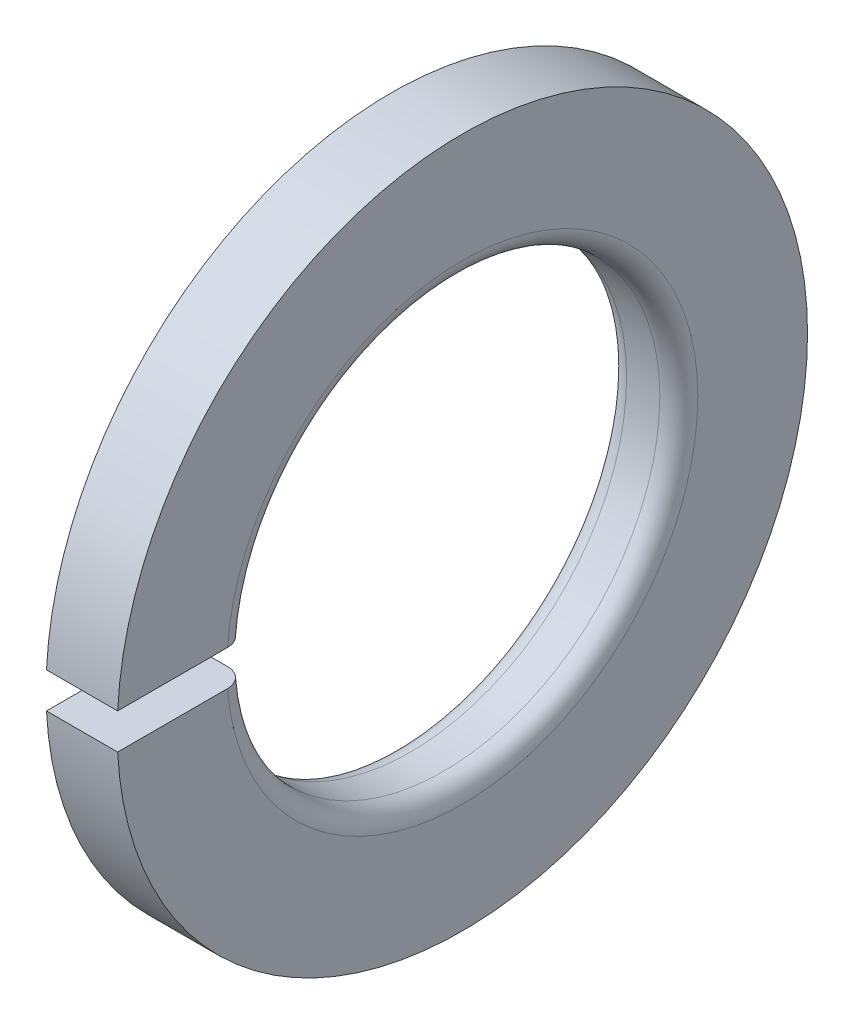
ISO-10303-21;
HEADER;
FILE_DESCRIPTION(('STEP AP214'),'2;1');
FILE_NAME('part.step','',(''),(''),'','','');
FILE_SCHEMA(('AUTOMOTIVE_DESIGN { 1 0 10303 214 1 1 1 1 }'));
ENDSEC;
DATA;
#1=APPLICATION_CONTEXT('core data for automotive mechanical design processes');
#2=APPLICATION_PROTOCOL_DEFINITION('international standard','automotive_design',2000,#1);
#3=PRODUCT_CONTEXT('',#1,'mechanical');
#4=PRODUCT('Part','Part','',(#3));
#5=PRODUCT_RELATED_PRODUCT_CATEGORY('part','',(#4));
#6=PRODUCT_DEFINITION_FORMATION('','',#4);
#7=PRODUCT_DEFINITION_CONTEXT('part definition',#1,'design');
#8=PRODUCT_DEFINITION('design','',#6,#7);
#9=PRODUCT_DEFINITION_SHAPE('','',#8);
#10=(LENGTH_UNIT() NAMED_UNIT(*) SI_UNIT(.MILLI.,.METRE.));
#11=(NAMED_UNIT(*) PLANE_ANGLE_UNIT() SI_UNIT($,.RADIAN.));
#12=(NAMED_UNIT(*) SI_UNIT($,.STERADIAN.) SOLID_ANGLE_UNIT());
#13=UNCERTAINTY_MEASURE_WITH_UNIT(LENGTH_MEASURE(1.E-05),#10,'distance_accuracy_value','');
#14=(GEOMETRIC_REPRESENTATION_CONTEXT(3) GLOBAL_UNCERTAINTY_ASSIGNED_CONTEXT((#13)) GLOBAL_UNIT_ASSIGNED_CONTEXT((#10,
#11,#12)) REPRESENTATION_CONTEXT('',''));
#15=CARTESIAN_POINT('',(0.,0.,0.));
#16=DIRECTION('',(0.,0.,1.));
#17=DIRECTION('',(1.,0.,0.));
#18=AXIS2_PLACEMENT_3D('',#15,#16,#17);
#19=CARTESIAN_POINT('',(-34.9249999999999,0.,0.));
#20=DIRECTION('',(-1.,0.,0.));
#21=DIRECTION('',(0.,0.,1.));
#22=AXIS2_PLACEMENT_3D('',#19,#20,#21);
#23=CYLINDRICAL_SURFACE('',#22,29.1);
#24=DIRECTION('',(-1.,0.,0.));
#25=VECTOR('',#24,1.);
#26=CARTESIAN_POINT('',(-34.9249999999999,1.5,29.0613144919496));
#27=LINE('',#26,#25);
#28=CARTESIAN_POINT('',(0.,1.5,29.0613144919496));
#29=VERTEX_POINT('',#28);
#30=CARTESIAN_POINT('',(-6.,1.5,29.0613144919496));
#31=VERTEX_POINT('',#30);
#32=EDGE_CURVE('E53',#29,#31,#27,.T.);
#33=ORIENTED_EDGE('',*,*,#32,.F.);
#34=CARTESIAN_POINT('',(0.,0.,0.));
#35=DIRECTION('',(-1.,0.,0.));
#36=DIRECTION('',(0.,0.,1.));
#37=AXIS2_PLACEMENT_3D('',#34,#35,#36);
#38=CIRCLE('',#37,29.1);
#39=CARTESIAN_POINT('',(0.,-1.5,29.0613144919496));
#40=VERTEX_POINT('',#39);
#41=EDGE_CURVE('E117',#29,#40,#38,.T.);
#42=ORIENTED_EDGE('',*,*,#41,.T.);
#43=DIRECTION('',(-1.,0.,0.));
#44=VECTOR('',#43,1.);
#45=CARTESIAN_POINT('',(-34.9249999999999,-1.5,29.0613144919496));
#46=LINE('',#45,#44);
#47=CARTESIAN_POINT('',(-6.,-1.5,29.0613144919496));
#48=VERTEX_POINT('',#47);
#49=EDGE_CURVE('E98',#48,#40,#46,.F.);
#50=ORIENTED_EDGE('',*,*,#49,.F.);
#51=CARTESIAN_POINT('',(-6.,0.,0.));
#52=DIRECTION('',(-1.,0.,0.));
#53=DIRECTION('',(0.,0.,1.));
#54=AXIS2_PLACEMENT_3D('',#51,#52,#53);
#55=CIRCLE('',#54,29.1);
#56=EDGE_CURVE('E140',#31,#48,#55,.T.);
#57=ORIENTED_EDGE('',*,*,#56,.F.);
#58=EDGE_LOOP('',(#33,#42,#50,#57));
#59=FACE_BOUND('',#58,.T.);
#60=ADVANCED_FACE('F37',(#59),#23,.T.);
#61=CARTESIAN_POINT('',(0.,19.85,0.));
#62=DIRECTION('',(-1.,0.,0.));
#63=DIRECTION('',(0.,0.,1.));
#64=AXIS2_PLACEMENT_3D('',#61,#62,#63);
#65=PLANE('',#64);
#66=DIRECTION('',(0.,0.,-1.));
#67=VECTOR('',#66,1.);
#68=CARTESIAN_POINT('',(0.,1.5,29.682));
#69=LINE('',#68,#67);
#70=CARTESIAN_POINT('',(0.,1.5,19.7932437968111));
#71=VERTEX_POINT('',#70);
#72=EDGE_CURVE('E105',#29,#71,#69,.T.);
#73=ORIENTED_EDGE('',*,*,#72,.T.);
#74=CARTESIAN_POINT('',(0.,0.,0.));
#75=DIRECTION('',(-1.,0.,0.));
#76=DIRECTION('',(0.,0.,1.));
#77=AXIS2_PLACEMENT_3D('',#74,#75,#76);
#78=CIRCLE('',#77,19.85);
#79=CARTESIAN_POINT('',(0.,-1.5,19.7932437968111));
#80=VERTEX_POINT('',#79);
#81=EDGE_CURVE('E107',#71,#80,#78,.T.);
#82=ORIENTED_EDGE('',*,*,#81,.T.);
#83=DIRECTION('',(0.,0.,1.));
#84=VECTOR('',#83,1.);
#85=CARTESIAN_POINT('',(0.,-1.5,0.));
#86=LINE('',#85,#84);
#87=EDGE_CURVE('E86',#80,#40,#86,.T.);
#88=ORIENTED_EDGE('',*,*,#87,.T.);
#89=ORIENTED_EDGE('',*,*,#41,.F.);
#90=EDGE_LOOP('',(#73,#82,#88,#89));
#91=FACE_BOUND('',#90,.T.);
#92=ADVANCED_FACE('F116',(#91),#65,.F.);
#93=CARTESIAN_POINT('',(-1.6,0.,0.));
#94=DIRECTION('',(-1.,0.,0.));
#95=DIRECTION('',(0.,0.,1.));
#96=AXIS2_PLACEMENT_3D('',#93,#94,#95);
#97=TOROIDAL_SURFACE('',#96,19.85,1.6);
#98=ORIENTED_EDGE('',*,*,#81,.F.);
#99=CARTESIAN_POINT('',(-1.35898862941232,1.5,18.2065697970712));
#100=CARTESIAN_POINT('',(-1.44756264219889,1.5,18.1930320440047));
#101=CARTESIAN_POINT('',(-1.53734436705855,1.5,18.1869657742528));
#102=CARTESIAN_POINT('',(-1.71672508267117,1.5,18.1899960073179));
#103=CARTESIAN_POINT('',(-1.80632372802799,1.5,18.1991105931413));
#104=CARTESIAN_POINT('',(-1.98267978527209,1.5,18.2322522732383));
#105=CARTESIAN_POINT('',(-2.06943862751872,1.5,18.2562717346096));
#106=CARTESIAN_POINT('',(-2.23767395505805,1.5,18.3185162662278));
#107=CARTESIAN_POINT('',(-2.31915170666891,1.5,18.356737916115));
#108=CARTESIAN_POINT('',(-2.47463573194463,1.5,18.4463332782058));
#109=CARTESIAN_POINT('',(-2.54863414894016,1.5,18.4977206241443));
#110=CARTESIAN_POINT('',(-2.68698778072629,1.5,18.6121581582613));
#111=CARTESIAN_POINT('',(-2.75134249542695,1.5,18.6752089508883));
#112=CARTESIAN_POINT('',(-2.86877662072559,1.5,18.8113725098221));
#113=CARTESIAN_POINT('',(-2.92182337797574,1.5,18.8845134372985));
#114=CARTESIAN_POINT('',(-3.01492839338455,1.5,19.0386410098248));
#115=CARTESIAN_POINT('',(-3.0549864516518,1.5,19.1196277755945));
#116=CARTESIAN_POINT('',(-3.12109977190569,1.5,19.2874120717265));
#117=CARTESIAN_POINT('',(-3.14711232451801,1.5,19.3742264327302));
#118=CARTESIAN_POINT('',(-3.18422209141426,1.5,19.5509866443176));
#119=CARTESIAN_POINT('',(-3.19531915789572,1.5,19.6409325259236));
#120=CARTESIAN_POINT('',(-3.20229183118463,1.5,19.8215710344792));
#121=CARTESIAN_POINT('',(-3.19814073119644,1.5,19.9122646937714));
#122=CARTESIAN_POINT('',(-3.17466942665468,1.5,20.091668060745));
#123=CARTESIAN_POINT('',(-3.1553491780564,1.5,20.1803777626651));
#124=CARTESIAN_POINT('',(-3.10208087640931,1.5,20.3532768185581));
#125=CARTESIAN_POINT('',(-3.06813506328876,1.5,20.4374668625043));
#126=CARTESIAN_POINT('',(-2.9865665247085,1.5,20.5989385297249));
#127=CARTESIAN_POINT('',(-2.93894390974055,1.5,20.676220208804));
#128=CARTESIAN_POINT('',(-2.83145952958272,1.5,20.8215313866775));
#129=CARTESIAN_POINT('',(-2.77161962727461,1.5,20.8895770561764));
#130=CARTESIAN_POINT('',(-2.64133933557313,1.5,21.014624888216));
#131=CARTESIAN_POINT('',(-2.57089908394285,1.5,21.0716271942552));
#132=CARTESIAN_POINT('',(-2.42160768621288,1.5,21.1728176319717));
#133=CARTESIAN_POINT('',(-2.34277815834402,1.5,21.2170376583009));
#134=CARTESIAN_POINT('',(-2.17880174150641,1.5,21.2915813400076));
#135=CARTESIAN_POINT('',(-2.09365493574573,1.5,21.3219051783811));
#136=CARTESIAN_POINT('',(-1.9196662955211,1.5,21.3677292166293));
#137=CARTESIAN_POINT('',(-1.83083316821152,1.5,21.3832624803174));
#138=CARTESIAN_POINT('',(-1.65182011224298,1.5,21.3991754498783));
#139=CARTESIAN_POINT('',(-1.5616401948385,1.5,21.3995552823101));
#140=CARTESIAN_POINT('',(-1.38260446434317,1.5,21.38515912134));
#141=CARTESIAN_POINT('',(-1.29374723391222,1.5,21.3704007452365));
#142=CARTESIAN_POINT('',(-1.11977076978006,1.5,21.326179749964));
#143=CARTESIAN_POINT('',(-1.0346515322168,1.5,21.2967171459877));
#144=CARTESIAN_POINT('',(-0.87053613982388,1.5,21.2239224595834));
#145=CARTESIAN_POINT('',(-0.791541834195377,1.5,21.1805862086086));
#146=CARTESIAN_POINT('',(-0.641934076647546,1.5,21.0812876423963));
#147=CARTESIAN_POINT('',(-0.57132068604379,1.5,21.0253252347933));
#148=CARTESIAN_POINT('',(-0.440349901223056,1.5,20.9022674852953));
#149=CARTESIAN_POINT('',(-0.38000975893144,1.5,20.8351537831413));
#150=CARTESIAN_POINT('',(-0.271420338049165,1.5,20.6917701667164));
#151=CARTESIAN_POINT('',(-0.22317119834632,1.5,20.6155001472828));
#152=CARTESIAN_POINT('',(-0.140006443732164,1.5,20.4557686412415));
#153=CARTESIAN_POINT('',(-0.105123913631718,1.5,20.3722899290199));
#154=CARTESIAN_POINT('',(-0.0498316399833283,1.5,20.2006695798564));
#155=CARTESIAN_POINT('',(-0.029422123933152,1.5,20.1125278696414));
#156=CARTESIAN_POINT('',(-0.00361029931817148,1.5,19.9338623377287));
#157=CARTESIAN_POINT('',(0.00175670724642623,1.5,19.8433334149511));
#158=CARTESIAN_POINT('',(-0.00276354879845688,1.5,19.6626566676938));
#159=CARTESIAN_POINT('',(-0.0126509853949023,1.5,19.5725088475725));
#160=CARTESIAN_POINT('',(-0.0474234873886119,1.5,19.3950362522409));
#161=CARTESIAN_POINT('',(-0.0723272144995143,1.5,19.3077151324688));
#162=CARTESIAN_POINT('',(-0.136448616705549,1.5,19.1384998728598));
#163=CARTESIAN_POINT('',(-0.175665733574809,1.5,19.0566055215247));
#164=CARTESIAN_POINT('',(-0.267279982419321,1.5,18.9006318707112));
#165=CARTESIAN_POINT('',(-0.319667817885635,1.5,18.8265471109892));
#166=CARTESIAN_POINT('',(-0.43618078430084,1.5,18.6882315830034));
#167=CARTESIAN_POINT('',(-0.500308705570106,1.5,18.6240031640269));
#168=CARTESIAN_POINT('',(-0.638334807094057,1.5,18.5073897056886));
#169=CARTESIAN_POINT('',(-0.71221416670987,1.5,18.4549823660662));
#170=CARTESIAN_POINT('',(-0.867689377618268,1.5,18.3634172873524));
#171=CARTESIAN_POINT('',(-0.949275652140454,1.5,18.3242433742089));
#172=CARTESIAN_POINT('',(-1.0860658761961,1.5,18.2722771118594));
#173=CARTESIAN_POINT('',(-1.13964885389551,1.5,18.2551041086582));
#174=CARTESIAN_POINT('',(-1.24832564735517,1.5,18.2264970835713));
#175=CARTESIAN_POINT('',(-1.30341946060914,1.5,18.215063052166));
#176=CARTESIAN_POINT('',(-1.35898862941232,1.5,18.2065697970712));
#177=B_SPLINE_CURVE_WITH_KNOTS('',3,(#99,#100,#101,#102,#103,#104,#105,#106,#107,#108,#109,#110,
#111,#112,#113,#114,#115,#116,#117,#118,#119,#120,#121,#122,#123,#124,#125,#126,#127,#128,#129,
#130,#131,#132,#133,#134,#135,#136,#137,#138,#139,#140,#141,#142,#143,#144,#145,#146,#147,#148,
#149,#150,#151,#152,#153,#154,#155,#156,#157,#158,#159,#160,#161,#162,#163,#164,#165,#166,#167,
#168,#169,#170,#171,#172,#173,#174,#175,#176),.UNSPECIFIED.,.T.,.F.,(4,2,2,2,2,2,2,2,2,2,2,2,2,
2,2,2,2,2,2,2,2,2,2,2,2,2,2,2,2,2,2,2,2,2,2,2,2,2,4),(0.,0.268602518172523,0.537525216954459,
0.806310311862341,1.07503071628382,1.34403052683165,1.61304428198022,1.8828246341334,
2.15260913791189,2.42320944359887,2.69381243073406,2.96488959828007,3.23596755292079,
3.50700400629479,3.77803827008875,4.04859170255715,4.31914161919272,4.58901050767115,
4.85887584220014,5.12813647597752,5.39739486093241,5.66634024786311,5.93528535691632,
6.20431135055502,6.47333931229222,6.74281469104966,7.01229316509477,7.28243440438609,
7.55257988986734,7.82335882834509,8.09414085525769,8.36526009606448,8.63636876428099,
8.90728660596402,9.17826892173335,9.4487356771476,9.71887065863252,9.88738558713909,
10.055900236117),.UNSPECIFIED.);
#178=CARTESIAN_POINT('',(-1.60000000000001,1.5,18.1882517026788));
#179=VERTEX_POINT('',#178);
#180=EDGE_CURVE('E150',#71,#179,#177,.T.);
#181=ORIENTED_EDGE('',*,*,#180,.T.);
#182=CARTESIAN_POINT('',(-1.60000000000001,0.,0.));
#183=DIRECTION('',(-1.,0.,0.));
#184=DIRECTION('',(0.,0.,1.));
#185=AXIS2_PLACEMENT_3D('',#182,#183,#184);
#186=CIRCLE('',#185,18.25);
#187=CARTESIAN_POINT('',(-1.60000000000001,-1.5,18.1882517026788));
#188=VERTEX_POINT('',#187);
#189=EDGE_CURVE('E111',#179,#188,#186,.T.);
#190=ORIENTED_EDGE('',*,*,#189,.T.);
#191=CARTESIAN_POINT('',(-1.35898862941232,-1.5,18.2065697970712));
#192=CARTESIAN_POINT('',(-1.2702828615628,-1.5,18.2201358448888));
#193=CARTESIAN_POINT('',(-1.18265946886249,-1.5,18.2412156275596));
#194=CARTESIAN_POINT('',(-1.01212827608701,-1.5,18.2978180851211));
#195=CARTESIAN_POINT('',(-0.929226351107397,-1.5,18.3333583245978));
#196=CARTESIAN_POINT('',(-0.770605511619332,-1.5,18.4178303806316));
#197=CARTESIAN_POINT('',(-0.69488241464164,-1.5,18.46675433431));
#198=CARTESIAN_POINT('',(-0.552724592282634,-1.5,18.5765829245361));
#199=CARTESIAN_POINT('',(-0.486287620565732,-1.5,18.6374846550213));
#200=CARTESIAN_POINT('',(-0.364403298808446,-1.5,18.7696823748797));
#201=CARTESIAN_POINT('',(-0.308979824689325,-1.5,18.8410003774852));
#202=CARTESIAN_POINT('',(-0.210846965099342,-1.5,18.9919080063849));
#203=CARTESIAN_POINT('',(-0.168138285374553,-1.5,19.0714980914977));
#204=CARTESIAN_POINT('',(-0.0965161618207194,-1.5,19.236950753855));
#205=CARTESIAN_POINT('',(-0.0676453537648036,-1.5,19.3228317889129));
#206=CARTESIAN_POINT('',(-0.0247004216836366,-1.5,19.4982170639294));
#207=CARTESIAN_POINT('',(-0.010626458247275,-1.5,19.5877213431999));
#208=CARTESIAN_POINT('',(0.00234250759080364,-1.5,19.7679967466625));
#209=CARTESIAN_POINT('',(0.00120826968800519,-1.5,19.8587699759636));
#210=CARTESIAN_POINT('',(-0.0162824537952204,-1.5,20.0388381712476));
#211=CARTESIAN_POINT('',(-0.0326389544735772,-1.5,20.1281331357643));
#212=CARTESIAN_POINT('',(-0.0801212105075573,-1.5,20.3027102833833));
#213=CARTESIAN_POINT('',(-0.111247501407328,-1.5,20.3879923208559));
#214=CARTESIAN_POINT('',(-0.187399044362751,-1.5,20.5521078274884));
#215=CARTESIAN_POINT('',(-0.232424215877482,-1.5,20.6309413340127));
#216=CARTESIAN_POINT('',(-0.335021098728203,-1.5,20.7797793165647));
#217=CARTESIAN_POINT('',(-0.392572016464512,-1.5,20.8497981250976));
#218=CARTESIAN_POINT('',(-0.518638804642939,-1.5,20.9791497299572));
#219=CARTESIAN_POINT('',(-0.587154529943274,-1.5,21.0384826677115));
#220=CARTESIAN_POINT('',(-0.733023483226778,-1.5,21.1446206659053));
#221=CARTESIAN_POINT('',(-0.810354280534633,-1.5,21.1914565535414));
#222=CARTESIAN_POINT('',(-0.971795255738864,-1.5,21.2714458829956));
#223=CARTESIAN_POINT('',(-1.05590534394941,-1.5,21.3045995057863));
#224=CARTESIAN_POINT('',(-1.22830821167201,-1.5,21.3562070318146));
#225=CARTESIAN_POINT('',(-1.31659088372152,-1.5,21.3746947037559));
#226=CARTESIAN_POINT('',(-1.49500758649364,-1.5,21.3965648748582));
#227=CARTESIAN_POINT('',(-1.58514160041917,-1.5,21.3999475110051));
#228=CARTESIAN_POINT('',(-1.76457850690134,-1.5,21.3915157945795));
#229=CARTESIAN_POINT('',(-1.85388232375839,-1.5,21.379721094972));
#230=CARTESIAN_POINT('',(-2.02924237233441,-1.5,21.3413081635649));
#231=CARTESIAN_POINT('',(-2.11529860941422,-1.5,21.3146899562359));
#232=CARTESIAN_POINT('',(-2.28173832888175,-1.5,21.247389411192));
#233=CARTESIAN_POINT('',(-2.36212094053299,-1.5,21.2067049203384));
#234=CARTESIAN_POINT('',(-2.51492892830416,-1.5,21.1124381826377));
#235=CARTESIAN_POINT('',(-2.58735425617491,-1.5,21.0588558575905));
#236=CARTESIAN_POINT('',(-2.72231551219307,-1.5,20.9402303476218));
#237=CARTESIAN_POINT('',(-2.7848359735773,-1.5,20.8751695670898));
#238=CARTESIAN_POINT('',(-2.89809849014268,-1.5,20.7354972074255));
#239=CARTESIAN_POINT('',(-2.94884039728093,-1.5,20.6608855082674));
#240=CARTESIAN_POINT('',(-3.03723708013841,-1.5,20.5040370158402));
#241=CARTESIAN_POINT('',(-3.07485991682572,-1.5,20.4217822225949));
#242=CARTESIAN_POINT('',(-3.13579979332443,-1.5,20.2521340136867));
#243=CARTESIAN_POINT('',(-3.15911664848707,-1.5,20.1647405317143));
#244=CARTESIAN_POINT('',(-3.19083712295782,-1.5,19.9870705998533));
#245=CARTESIAN_POINT('',(-3.19920476688805,-1.5,19.8967877261449));
#246=CARTESIAN_POINT('',(-3.2006869814804,-1.5,19.7160963617466));
#247=CARTESIAN_POINT('',(-3.19380136793254,-1.5,19.6256878695527));
#248=CARTESIAN_POINT('',(-3.16495187673286,-1.5,19.4471811393607));
#249=CARTESIAN_POINT('',(-3.14296727694056,-1.5,19.3590862493232));
#250=CARTESIAN_POINT('',(-3.08451471803245,-1.5,19.1878392676738));
#251=CARTESIAN_POINT('',(-3.04804671518917,-1.5,19.1046871909857));
#252=CARTESIAN_POINT('',(-2.96166734063066,-1.5,18.9457270839862));
#253=CARTESIAN_POINT('',(-2.91176117687551,-1.5,18.8699162240285));
#254=CARTESIAN_POINT('',(-2.79990487081647,-1.5,18.727775943562));
#255=CARTESIAN_POINT('',(-2.73795532255682,-1.5,18.6614460556808));
#256=CARTESIAN_POINT('',(-2.60392079867125,-1.5,18.5403172974112));
#257=CARTESIAN_POINT('',(-2.53185988272459,-1.5,18.4854918037973));
#258=CARTESIAN_POINT('',(-2.37951170949177,-1.5,18.3887486394602));
#259=CARTESIAN_POINT('',(-2.29922254516656,-1.5,18.3468339701017));
#260=CARTESIAN_POINT('',(-2.13295593837108,-1.5,18.2772428812663));
#261=CARTESIAN_POINT('',(-2.04699428657167,-1.5,18.2495286743792));
#262=CARTESIAN_POINT('',(-1.87170264872835,-1.5,18.2090029826223));
#263=CARTESIAN_POINT('',(-1.78237692815419,-1.5,18.1961732409649));
#264=CARTESIAN_POINT('',(-1.63697486679475,-1.5,18.1877018316832));
#265=CARTESIAN_POINT('',(-1.58112973774576,-1.5,18.1873883515051));
#266=CARTESIAN_POINT('',(-1.46971314242031,-1.5,18.1926049769725));
#267=CARTESIAN_POINT('',(-1.41414167559521,-1.5,18.1981350708979));
#268=CARTESIAN_POINT('',(-1.35898862941232,-1.5,18.2065697970712));
#269=B_SPLINE_CURVE_WITH_KNOTS('',3,(#191,#192,#193,#194,#195,#196,#197,#198,#199,#200,#201,
#202,#203,#204,#205,#206,#207,#208,#209,#210,#211,#212,#213,#214,#215,#216,#217,#218,#219,#220,
#221,#222,#223,#224,#225,#226,#227,#228,#229,#230,#231,#232,#233,#234,#235,#236,#237,#238,#239,
#240,#241,#242,#243,#244,#245,#246,#247,#248,#249,#250,#251,#252,#253,#254,#255,#256,#257,#258,
#259,#260,#261,#262,#263,#264,#265,#266,#267,#268),.UNSPECIFIED.,.T.,.F.,(4,2,2,2,2,2,2,2,2,2,2,
2,2,2,2,2,2,2,2,2,2,2,2,2,2,2,2,2,2,2,2,2,2,2,2,2,2,2,4),(0.,0.269007109983916,0.53834195316348,
0.80751890176209,1.076630622711,1.34631952873907,1.61602340130217,1.88655299835131,
2.15708553140472,2.42813828285402,2.69919130314245,2.97025415240949,3.24131543095711,
3.5119301154336,3.78254121806431,4.05247848462414,4.32241218066663,4.59172252912069,
4.86103043522238,5.12998996814843,5.3989490570785,5.66794933405682,5.93695124203439,
6.20636915054589,6.47579044514766,6.74586315344102,7.01593934751706,7.28666461073962,
7.55739314346495,7.82849397368381,8.09959562240146,8.37059235650057,8.64157572697872,
8.91192490362075,9.18233688068072,9.45202550536377,9.72138298809129,9.88863920690257,
10.0558950902589),.UNSPECIFIED.);
#270=EDGE_CURVE('E94',#188,#80,#269,.T.);
#271=ORIENTED_EDGE('',*,*,#270,.T.);
#272=EDGE_LOOP('',(#98,#181,#190,#271));
#273=FACE_BOUND('',#272,.T.);
#274=ADVANCED_FACE('F110',(#273),#97,.T.);
#275=CARTESIAN_POINT('',(-34.9249999999999,0.,0.));
#276=DIRECTION('',(-1.,0.,0.));
#277=DIRECTION('',(0.,0.,1.));
#278=AXIS2_PLACEMENT_3D('',#275,#276,#277);
#279=CYLINDRICAL_SURFACE('',#278,18.25);
#280=DIRECTION('',(-1.,0.,0.));
#281=VECTOR('',#280,1.);
#282=CARTESIAN_POINT('',(-34.9249999999999,1.5,18.1882517026788));
#283=LINE('',#282,#281);
#284=CARTESIAN_POINT('',(-4.39999999999999,1.5,18.1882517026788));
#285=VERTEX_POINT('',#284);
#286=EDGE_CURVE('E159',#285,#179,#283,.F.);
#287=ORIENTED_EDGE('',*,*,#286,.F.);
#288=CARTESIAN_POINT('',(-4.39999999999999,0.,0.));
#289=DIRECTION('',(-1.,0.,0.));
#290=DIRECTION('',(0.,0.,1.));
#291=AXIS2_PLACEMENT_3D('',#288,#289,#290);
#292=CIRCLE('',#291,18.25);
#293=CARTESIAN_POINT('',(-4.39999999999999,-1.5,18.1882517026788));
#294=VERTEX_POINT('',#293);
#295=EDGE_CURVE('E121',#285,#294,#292,.T.);
#296=ORIENTED_EDGE('',*,*,#295,.T.);
#297=DIRECTION('',(-1.,0.,0.));
#298=VECTOR('',#297,1.);
#299=CARTESIAN_POINT('',(-34.9249999999999,-1.5,18.1882517026788));
#300=LINE('',#299,#298);
#301=EDGE_CURVE('E113',#188,#294,#300,.T.);
#302=ORIENTED_EDGE('',*,*,#301,.F.);
#303=ORIENTED_EDGE('',*,*,#189,.F.);
#304=EDGE_LOOP('',(#287,#296,#302,#303));
#305=FACE_BOUND('',#304,.T.);
#306=ADVANCED_FACE('F157',(#305),#279,.F.);
#307=CARTESIAN_POINT('',(-4.4,0.,0.));
#308=DIRECTION('',(-1.,0.,0.));
#309=DIRECTION('',(0.,0.,1.));
#310=AXIS2_PLACEMENT_3D('',#307,#308,#309);
#311=TOROIDAL_SURFACE('',#310,19.85,1.6);
#312=ORIENTED_EDGE('',*,*,#295,.F.);
#313=CARTESIAN_POINT('',(-4.64101137058768,1.5,18.2065697970712));
#314=CARTESIAN_POINT('',(-4.7297171384372,1.5,18.2201358448888));
#315=CARTESIAN_POINT('',(-4.81734053113751,1.5,18.2412156275595));
#316=CARTESIAN_POINT('',(-4.98787172391299,1.5,18.2978180851211));
#317=CARTESIAN_POINT('',(-5.0707736488926,1.5,18.3333583245978));
#318=CARTESIAN_POINT('',(-5.22939448838067,1.5,18.4178303806316));
#319=CARTESIAN_POINT('',(-5.30511758535836,1.5,18.46675433431));
#320=CARTESIAN_POINT('',(-5.44727540771737,1.5,18.5765829245361));
#321=CARTESIAN_POINT('',(-5.51371237943427,1.5,18.6374846550213));
#322=CARTESIAN_POINT('',(-5.63559670119155,1.5,18.7696823748797));
#323=CARTESIAN_POINT('',(-5.69102017531067,1.5,18.8410003774852));
#324=CARTESIAN_POINT('',(-5.78915303490066,1.5,18.9919080063849));
#325=CARTESIAN_POINT('',(-5.83186171462545,1.5,19.0714980914977));
#326=CARTESIAN_POINT('',(-5.90348383817928,1.5,19.236950753855));
#327=CARTESIAN_POINT('',(-5.93235464623519,1.5,19.3228317889129));
#328=CARTESIAN_POINT('',(-5.97529957831636,1.5,19.4982170639294));
#329=CARTESIAN_POINT('',(-5.98937354175272,1.5,19.5877213431999));
#330=CARTESIAN_POINT('',(-6.0023425075908,1.5,19.7679967466625));
#331=CARTESIAN_POINT('',(-6.001208269688,1.5,19.8587699759636));
#332=CARTESIAN_POINT('',(-5.98371754620478,1.5,20.0388381712476));
#333=CARTESIAN_POINT('',(-5.96736104552642,1.5,20.1281331357643));
#334=CARTESIAN_POINT('',(-5.91987878949244,1.5,20.3027102833833));
#335=CARTESIAN_POINT('',(-5.88875249859267,1.5,20.3879923208559));
#336=CARTESIAN_POINT('',(-5.81260095563725,1.5,20.5521078274884));
#337=CARTESIAN_POINT('',(-5.76757578412252,1.5,20.6309413340127));
#338=CARTESIAN_POINT('',(-5.6649789012718,1.5,20.7797793165647));
#339=CARTESIAN_POINT('',(-5.60742798353549,1.5,20.8497981250976));
#340=CARTESIAN_POINT('',(-5.48136119535706,1.5,20.9791497299572));
#341=CARTESIAN_POINT('',(-5.41284547005672,1.5,21.0384826677115));
#342=CARTESIAN_POINT('',(-5.26697651677322,1.5,21.1446206659053));
#343=CARTESIAN_POINT('',(-5.18964571946537,1.5,21.1914565535414));
#344=CARTESIAN_POINT('',(-5.02820474426113,1.5,21.2714458829956));
#345=CARTESIAN_POINT('',(-4.94409465605059,1.5,21.3045995057863));
#346=CARTESIAN_POINT('',(-4.77169178832799,1.5,21.3562070318146));
#347=CARTESIAN_POINT('',(-4.68340911627848,1.5,21.3746947037559));
#348=CARTESIAN_POINT('',(-4.50499241350636,1.5,21.3965648748582));
#349=CARTESIAN_POINT('',(-4.41485839958083,1.5,21.3999475110051));
#350=CARTESIAN_POINT('',(-4.23542149309866,1.5,21.3915157945795));
#351=CARTESIAN_POINT('',(-4.1461176762416,1.5,21.379721094972));
#352=CARTESIAN_POINT('',(-3.97075762766558,1.5,21.3413081635649));
#353=CARTESIAN_POINT('',(-3.88470139058578,1.5,21.3146899562359));
#354=CARTESIAN_POINT('',(-3.71826167111824,1.5,21.247389411192));
#355=CARTESIAN_POINT('',(-3.63787905946701,1.5,21.2067049203384));
#356=CARTESIAN_POINT('',(-3.48507107169584,1.5,21.1124381826377));
#357=CARTESIAN_POINT('',(-3.41264574382509,1.5,21.0588558575905));
#358=CARTESIAN_POINT('',(-3.27768448780693,1.5,20.9402303476218));
#359=CARTESIAN_POINT('',(-3.21516402642269,1.5,20.8751695670898));
#360=CARTESIAN_POINT('',(-3.10190150985732,1.5,20.7354972074255));
#361=CARTESIAN_POINT('',(-3.05115960271907,1.5,20.6608855082674));
#362=CARTESIAN_POINT('',(-2.96276291986159,1.5,20.5040370158402));
#363=CARTESIAN_POINT('',(-2.92514008317428,1.5,20.4217822225949));
#364=CARTESIAN_POINT('',(-2.86420020667557,1.5,20.2521340136867));
#365=CARTESIAN_POINT('',(-2.84088335151292,1.5,20.1647405317143));
#366=CARTESIAN_POINT('',(-2.80916287704218,1.5,19.9870705998533));
#367=CARTESIAN_POINT('',(-2.80079523311195,1.5,19.8967877261449));
#368=CARTESIAN_POINT('',(-2.7993130185196,1.5,19.7160963617466));
#369=CARTESIAN_POINT('',(-2.80619863206746,1.5,19.6256878695527));
#370=CARTESIAN_POINT('',(-2.83504812326713,1.5,19.4471811393607));
#371=CARTESIAN_POINT('',(-2.85703272305944,1.5,19.3590862493232));
#372=CARTESIAN_POINT('',(-2.91548528196754,1.5,19.1878392676738));
#373=CARTESIAN_POINT('',(-2.95195328481083,1.5,19.1046871909857));
#374=CARTESIAN_POINT('',(-3.03833265936934,1.5,18.9457270839862));
#375=CARTESIAN_POINT('',(-3.08823882312449,1.5,18.8699162240285));
#376=CARTESIAN_POINT('',(-3.20009512918353,1.5,18.727775943562));
#377=CARTESIAN_POINT('',(-3.26204467744318,1.5,18.6614460556808));
#378=CARTESIAN_POINT('',(-3.39607920132875,1.5,18.5403172974112));
#379=CARTESIAN_POINT('',(-3.46814011727541,1.5,18.4854918037973));
#380=CARTESIAN_POINT('',(-3.62048829050822,1.5,18.3887486394602));
#381=CARTESIAN_POINT('',(-3.70077745483344,1.5,18.3468339701017));
#382=CARTESIAN_POINT('',(-3.86704406162892,1.5,18.2772428812663));
#383=CARTESIAN_POINT('',(-3.95300571342833,1.5,18.2495286743792));
#384=CARTESIAN_POINT('',(-4.12829735127165,1.5,18.2090029826223));
#385=CARTESIAN_POINT('',(-4.21762307184581,1.5,18.1961732409649));
#386=CARTESIAN_POINT('',(-4.36302513320525,1.5,18.1877018316832));
#387=CARTESIAN_POINT('',(-4.41887026225424,1.5,18.1873883515051));
#388=CARTESIAN_POINT('',(-4.53028685757968,1.5,18.1926049769725));
#389=CARTESIAN_POINT('',(-4.58585832440478,1.5,18.1981350708979));
#390=CARTESIAN_POINT('',(-4.64101137058768,1.5,18.2065697970712));
#391=B_SPLINE_CURVE_WITH_KNOTS('',3,(#313,#314,#315,#316,#317,#318,#319,#320,#321,#322,#323,
#324,#325,#326,#327,#328,#329,#330,#331,#332,#333,#334,#335,#336,#337,#338,#339,#340,#341,#342,
#343,#344,#345,#346,#347,#348,#349,#350,#351,#352,#353,#354,#355,#356,#357,#358,#359,#360,#361,
#362,#363,#364,#365,#366,#367,#368,#369,#370,#371,#372,#373,#374,#375,#376,#377,#378,#379,#380,
#381,#382,#383,#384,#385,#386,#387,#388,#389,#390),.UNSPECIFIED.,.T.,.F.,(4,2,2,2,2,2,2,2,2,2,2,
2,2,2,2,2,2,2,2,2,2,2,2,2,2,2,2,2,2,2,2,2,2,2,2,2,2,2,4),(0.,0.269007109983917,0.53834195316348,
0.80751890176209,1.076630622711,1.34631952873908,1.61602340130217,1.88655299835131,
2.15708553140473,2.42813828285402,2.69919130314245,2.97025415240949,3.24131543095711,
3.5119301154336,3.78254121806431,4.05247848462414,4.32241218066663,4.59172252912069,
4.86103043522238,5.12998996814843,5.3989490570785,5.66794933405682,5.93695124203439,
6.20636915054589,6.47579044514766,6.74586315344102,7.01593934751706,7.28666461073962,
7.55739314346495,7.82849397368381,8.09959562240146,8.37059235650057,8.64157572697872,
8.91192490362075,9.18233688068072,9.45202550536377,9.72138298809129,9.88863920690257,
10.0558950902589),.UNSPECIFIED.);
#392=CARTESIAN_POINT('',(-6.,1.5,19.7932437968111));
#393=VERTEX_POINT('',#392);
#394=EDGE_CURVE('E139',#285,#393,#391,.T.);
#395=ORIENTED_EDGE('',*,*,#394,.T.);
#396=CARTESIAN_POINT('',(-6.,0.,0.));
#397=DIRECTION('',(-1.,0.,0.));
#398=DIRECTION('',(0.,0.,1.));
#399=AXIS2_PLACEMENT_3D('',#396,#397,#398);
#400=CIRCLE('',#399,19.85);
#401=CARTESIAN_POINT('',(-6.,-1.5,19.7932437968111));
#402=VERTEX_POINT('',#401);
#403=EDGE_CURVE('E141',#393,#402,#400,.T.);
#404=ORIENTED_EDGE('',*,*,#403,.T.);
#405=CARTESIAN_POINT('',(-4.64101137058768,-1.5,18.2065697970712));
#406=CARTESIAN_POINT('',(-4.55243735780111,-1.5,18.1930320440047));
#407=CARTESIAN_POINT('',(-4.46265563294145,-1.5,18.1869657742528));
#408=CARTESIAN_POINT('',(-4.28327491732883,-1.5,18.1899960073179));
#409=CARTESIAN_POINT('',(-4.193676271972,-1.5,18.1991105931413));
#410=CARTESIAN_POINT('',(-4.01732021472791,-1.5,18.2322522732383));
#411=CARTESIAN_POINT('',(-3.93056137248128,-1.5,18.2562717346096));
#412=CARTESIAN_POINT('',(-3.76232604494195,-1.5,18.3185162662278));
#413=CARTESIAN_POINT('',(-3.68084829333109,-1.5,18.356737916115));
#414=CARTESIAN_POINT('',(-3.52536426805536,-1.5,18.4463332782058));
#415=CARTESIAN_POINT('',(-3.45136585105983,-1.5,18.4977206241443));
#416=CARTESIAN_POINT('',(-3.31301221927371,-1.5,18.6121581582613));
#417=CARTESIAN_POINT('',(-3.24865750457305,-1.5,18.6752089508883));
#418=CARTESIAN_POINT('',(-3.1312233792744,-1.5,18.8113725098221));
#419=CARTESIAN_POINT('',(-3.07817662202426,-1.5,18.8845134372985));
#420=CARTESIAN_POINT('',(-2.98507160661545,-1.5,19.0386410098248));
#421=CARTESIAN_POINT('',(-2.94501354834819,-1.5,19.1196277755945));
#422=CARTESIAN_POINT('',(-2.87890022809431,-1.5,19.2874120717265));
#423=CARTESIAN_POINT('',(-2.85288767548199,-1.5,19.3742264327302));
#424=CARTESIAN_POINT('',(-2.81577790858574,-1.5,19.5509866443176));
#425=CARTESIAN_POINT('',(-2.80468084210428,-1.5,19.6409325259236));
#426=CARTESIAN_POINT('',(-2.79770816881537,-1.5,19.8215710344792));
#427=CARTESIAN_POINT('',(-2.80185926880356,-1.5,19.9122646937714));
#428=CARTESIAN_POINT('',(-2.82533057334532,-1.5,20.091668060745));
#429=CARTESIAN_POINT('',(-2.8446508219436,-1.5,20.1803777626651));
#430=CARTESIAN_POINT('',(-2.89791912359069,-1.5,20.3532768185581));
#431=CARTESIAN_POINT('',(-2.93186493671124,-1.5,20.4374668625043));
#432=CARTESIAN_POINT('',(-3.0134334752915,-1.5,20.598938529725));
#433=CARTESIAN_POINT('',(-3.06105609025945,-1.5,20.676220208804));
#434=CARTESIAN_POINT('',(-3.16854047041728,-1.5,20.8215313866775));
#435=CARTESIAN_POINT('',(-3.22838037272539,-1.5,20.8895770561764));
#436=CARTESIAN_POINT('',(-3.35866066442686,-1.5,21.014624888216));
#437=CARTESIAN_POINT('',(-3.42910091605715,-1.5,21.0716271942552));
#438=CARTESIAN_POINT('',(-3.57839231378711,-1.5,21.1728176319717));
#439=CARTESIAN_POINT('',(-3.65722184165597,-1.5,21.2170376583009));
#440=CARTESIAN_POINT('',(-3.82119825849359,-1.5,21.2915813400076));
#441=CARTESIAN_POINT('',(-3.90634506425427,-1.5,21.3219051783811));
#442=CARTESIAN_POINT('',(-4.0803337044789,-1.5,21.3677292166293));
#443=CARTESIAN_POINT('',(-4.16916683178848,-1.5,21.3832624803174));
#444=CARTESIAN_POINT('',(-4.34817988775702,-1.5,21.3991754498783));
#445=CARTESIAN_POINT('',(-4.4383598051615,-1.5,21.3995552823101));
#446=CARTESIAN_POINT('',(-4.61739553565683,-1.5,21.38515912134));
#447=CARTESIAN_POINT('',(-4.70625276608778,-1.5,21.3704007452365));
#448=CARTESIAN_POINT('',(-4.88022923021994,-1.5,21.326179749964));
#449=CARTESIAN_POINT('',(-4.9653484677832,-1.5,21.2967171459877));
#450=CARTESIAN_POINT('',(-5.12946386017612,-1.5,21.2239224595834));
#451=CARTESIAN_POINT('',(-5.20845816580462,-1.5,21.1805862086086));
#452=CARTESIAN_POINT('',(-5.35806592335245,-1.5,21.0812876423963));
#453=CARTESIAN_POINT('',(-5.42867931395621,-1.5,21.0253252347933));
#454=CARTESIAN_POINT('',(-5.55965009877694,-1.5,20.9022674852953));
#455=CARTESIAN_POINT('',(-5.61999024106856,-1.5,20.8351537831413));
#456=CARTESIAN_POINT('',(-5.72857966195083,-1.5,20.6917701667164));
#457=CARTESIAN_POINT('',(-5.77682880165368,-1.5,20.6155001472828));
#458=CARTESIAN_POINT('',(-5.85999355626783,-1.5,20.4557686412415));
#459=CARTESIAN_POINT('',(-5.89487608636828,-1.5,20.3722899290199));
#460=CARTESIAN_POINT('',(-5.95016836001667,-1.5,20.2006695798564));
#461=CARTESIAN_POINT('',(-5.97057787606685,-1.5,20.1125278696414));
#462=CARTESIAN_POINT('',(-5.99638970068183,-1.5,19.9338623377287));
#463=CARTESIAN_POINT('',(-6.00175670724642,-1.5,19.8433334149511));
#464=CARTESIAN_POINT('',(-5.99723645120154,-1.5,19.6626566676938));
#465=CARTESIAN_POINT('',(-5.9873490146051,-1.5,19.5725088475725));
#466=CARTESIAN_POINT('',(-5.95257651261139,-1.5,19.3950362522409));
#467=CARTESIAN_POINT('',(-5.92767278550048,-1.5,19.3077151324688));
#468=CARTESIAN_POINT('',(-5.86355138329445,-1.5,19.1384998728598));
#469=CARTESIAN_POINT('',(-5.82433426642519,-1.5,19.0566055215247));
#470=CARTESIAN_POINT('',(-5.73272001758068,-1.5,18.9006318707112));
#471=CARTESIAN_POINT('',(-5.68033218211436,-1.5,18.8265471109892));
#472=CARTESIAN_POINT('',(-5.56381921569916,-1.5,18.6882315830034));
#473=CARTESIAN_POINT('',(-5.4996912944299,-1.5,18.6240031640269));
#474=CARTESIAN_POINT('',(-5.36166519290595,-1.5,18.5073897056886));
#475=CARTESIAN_POINT('',(-5.28778583329013,-1.5,18.4549823660662));
#476=CARTESIAN_POINT('',(-5.13231062238174,-1.5,18.3634172873524));
#477=CARTESIAN_POINT('',(-5.05072434785955,-1.5,18.3242433742089));
#478=CARTESIAN_POINT('',(-4.9139341238039,-1.5,18.2722771118594));
#479=CARTESIAN_POINT('',(-4.8603511461045,-1.5,18.2551041086582));
#480=CARTESIAN_POINT('',(-4.75167435264483,-1.5,18.2264970835713));
#481=CARTESIAN_POINT('',(-4.69658053939086,-1.5,18.215063052166));
#482=CARTESIAN_POINT('',(-4.64101137058768,-1.5,18.2065697970712));
#483=B_SPLINE_CURVE_WITH_KNOTS('',3,(#405,#406,#407,#408,#409,#410,#411,#412,#413,#414,#415,
#416,#417,#418,#419,#420,#421,#422,#423,#424,#425,#426,#427,#428,#429,#430,#431,#432,#433,#434,
#435,#436,#437,#438,#439,#440,#441,#442,#443,#444,#445,#446,#447,#448,#449,#450,#451,#452,#453,
#454,#455,#456,#457,#458,#459,#460,#461,#462,#463,#464,#465,#466,#467,#468,#469,#470,#471,#472,
#473,#474,#475,#476,#477,#478,#479,#480,#481,#482),.UNSPECIFIED.,.T.,.F.,(4,2,2,2,2,2,2,2,2,2,2,
2,2,2,2,2,2,2,2,2,2,2,2,2,2,2,2,2,2,2,2,2,2,2,2,2,2,2,4),(0.,0.268602518172523,
0.537525216954458,0.80631031186234,1.07503071628382,1.34403052683165,1.61304428198022,
1.8828246341334,2.15260913791188,2.42320944359887,2.69381243073406,2.96488959828007,
3.23596755292079,3.50700400629479,3.77803827008875,4.04859170255715,4.31914161919272,
4.58901050767115,4.85887584220014,5.12813647597752,5.39739486093241,5.66634024786311,
5.93528535691632,6.20431135055502,6.47333931229223,6.74281469104966,7.01229316509477,
7.28243440438608,7.55257988986734,7.82335882834509,8.09414085525769,8.36526009606448,
8.636368764281,8.90728660596402,9.17826892173334,9.44873567714759,9.71887065863252,
9.88738558713909,10.055900236117),.UNSPECIFIED.);
#484=EDGE_CURVE('E61',#402,#294,#483,.T.);
#485=ORIENTED_EDGE('',*,*,#484,.T.);
#486=EDGE_LOOP('',(#312,#395,#404,#485));
#487=FACE_BOUND('',#486,.T.);
#488=ADVANCED_FACE('F163',(#487),#311,.T.);
#489=CARTESIAN_POINT('',(-6.,29.1,0.));
#490=DIRECTION('',(1.,0.,0.));
#491=DIRECTION('',(0.,0.,-1.));
#492=AXIS2_PLACEMENT_3D('',#489,#490,#491);
#493=PLANE('',#492);
#494=DIRECTION('',(0.,0.,-1.));
#495=VECTOR('',#494,1.);
#496=CARTESIAN_POINT('',(-6.,1.5,0.));
#497=LINE('',#496,#495);
#498=EDGE_CURVE('E11',#31,#393,#497,.T.);
#499=ORIENTED_EDGE('',*,*,#498,.F.);
#500=ORIENTED_EDGE('',*,*,#56,.T.);
#501=DIRECTION('',(0.,0.,1.));
#502=VECTOR('',#501,1.);
#503=CARTESIAN_POINT('',(-6.,-1.5,0.));
#504=LINE('',#503,#502);
#505=EDGE_CURVE('E48',#402,#48,#504,.T.);
#506=ORIENTED_EDGE('',*,*,#505,.F.);
#507=ORIENTED_EDGE('',*,*,#403,.F.);
#508=EDGE_LOOP('',(#499,#500,#506,#507));
#509=FACE_BOUND('',#508,.T.);
#510=ADVANCED_FACE('F142',(#509),#493,.F.);
#511=CARTESIAN_POINT('',(-6.,-1.5,0.));
#512=DIRECTION('',(0.,1.,0.));
#513=DIRECTION('',(0.,0.,1.));
#514=AXIS2_PLACEMENT_3D('',#511,#512,#513);
#515=PLANE('',#514);
#516=ORIENTED_EDGE('',*,*,#49,.T.);
#517=ORIENTED_EDGE('',*,*,#87,.F.);
#518=ORIENTED_EDGE('',*,*,#270,.F.);
#519=ORIENTED_EDGE('',*,*,#301,.T.);
#520=ORIENTED_EDGE('',*,*,#484,.F.);
#521=ORIENTED_EDGE('',*,*,#505,.T.);
#522=EDGE_LOOP('',(#516,#517,#518,#519,#520,#521));
#523=FACE_BOUND('',#522,.T.);
#524=ADVANCED_FACE('F92',(#523),#515,.T.);
#525=CARTESIAN_POINT('',(-6.,1.5,29.682));
#526=DIRECTION('',(0.,-1.,0.));
#527=DIRECTION('',(0.,0.,-1.));
#528=AXIS2_PLACEMENT_3D('',#525,#526,#527);
#529=PLANE('',#528);
#530=ORIENTED_EDGE('',*,*,#32,.T.);
#531=ORIENTED_EDGE('',*,*,#498,.T.);
#532=ORIENTED_EDGE('',*,*,#394,.F.);
#533=ORIENTED_EDGE('',*,*,#286,.T.);
#534=ORIENTED_EDGE('',*,*,#180,.F.);
#535=ORIENTED_EDGE('',*,*,#72,.F.);
#536=EDGE_LOOP('',(#530,#531,#532,#533,#534,#535));
#537=FACE_BOUND('',#536,.T.);
#538=ADVANCED_FACE('F178',(#537),#529,.T.);
#539=CLOSED_SHELL('',(#60,#92,#274,#306,#488,#510,#524,#538));
#540=MANIFOLD_SOLID_BREP('B2',#539);
#541=ADVANCED_BREP_SHAPE_REPRESENTATION('',(#18,#540),#14);
#542=SHAPE_DEFINITION_REPRESENTATION(#9,#541);
ENDSEC;
END-ISO-10303-21;
